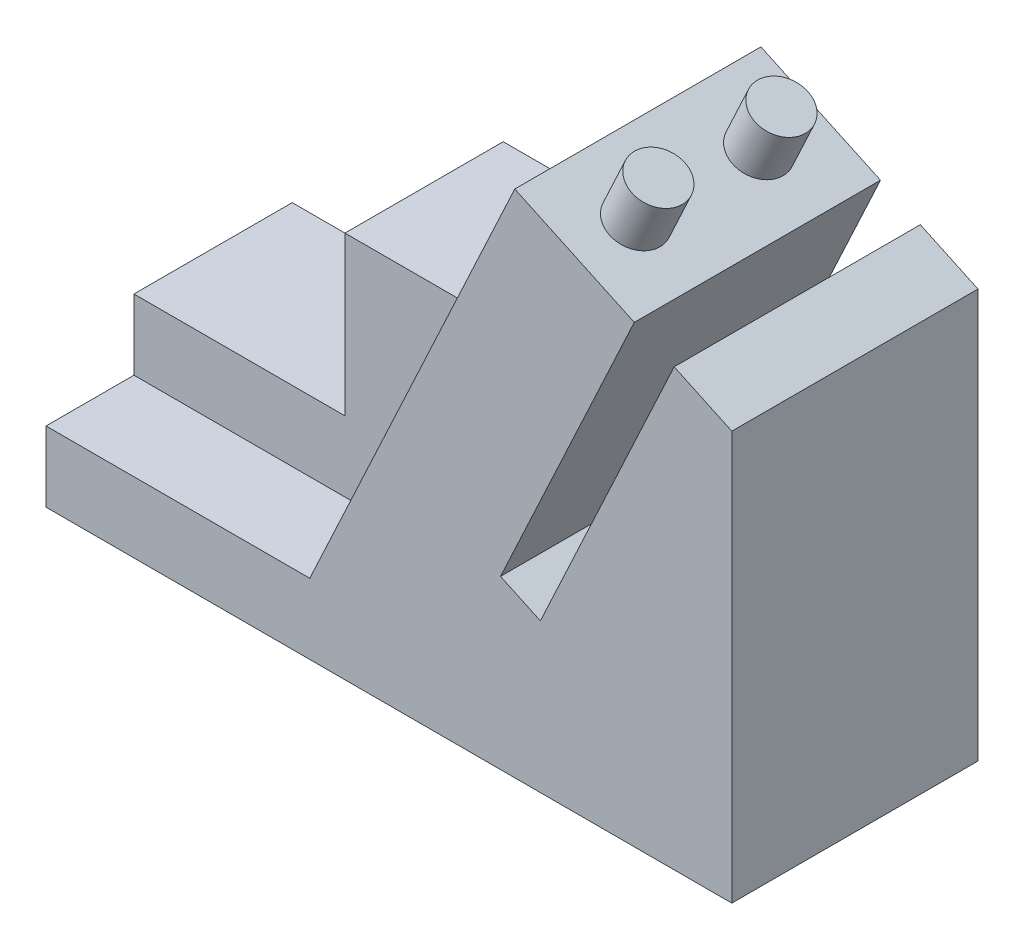
ISO-10303-21;
HEADER;
FILE_DESCRIPTION(('STEP AP214'),'2;1');
FILE_NAME('part.step','',(''),(''),'','','');
FILE_SCHEMA(('AUTOMOTIVE_DESIGN { 1 0 10303 214 1 1 1 1 }'));
ENDSEC;
DATA;
#1=APPLICATION_CONTEXT('core data for automotive mechanical design processes');
#2=APPLICATION_PROTOCOL_DEFINITION('international standard','automotive_design',2000,#1);
#3=PRODUCT_CONTEXT('',#1,'mechanical');
#4=PRODUCT('Part','Part','',(#3));
#5=PRODUCT_RELATED_PRODUCT_CATEGORY('part','',(#4));
#6=PRODUCT_DEFINITION_FORMATION('','',#4);
#7=PRODUCT_DEFINITION_CONTEXT('part definition',#1,'design');
#8=PRODUCT_DEFINITION('design','',#6,#7);
#9=PRODUCT_DEFINITION_SHAPE('','',#8);
#10=(LENGTH_UNIT() NAMED_UNIT(*) SI_UNIT(.MILLI.,.METRE.));
#11=(NAMED_UNIT(*) PLANE_ANGLE_UNIT() SI_UNIT($,.RADIAN.));
#12=(NAMED_UNIT(*) SI_UNIT($,.STERADIAN.) SOLID_ANGLE_UNIT());
#13=UNCERTAINTY_MEASURE_WITH_UNIT(LENGTH_MEASURE(1.E-05),#10,'distance_accuracy_value','');
#14=(GEOMETRIC_REPRESENTATION_CONTEXT(3) GLOBAL_UNCERTAINTY_ASSIGNED_CONTEXT((#13)) GLOBAL_UNIT_ASSIGNED_CONTEXT((#10,
#11,#12)) REPRESENTATION_CONTEXT('',''));
#15=CARTESIAN_POINT('',(0.,0.,0.));
#16=DIRECTION('',(0.,0.,1.));
#17=DIRECTION('',(1.,0.,0.));
#18=AXIS2_PLACEMENT_3D('',#15,#16,#17);
#19=CARTESIAN_POINT('',(53.3153829077502,58.,28.));
#20=DIRECTION('',(0.906307787036648,-0.422618261740704,0.));
#21=DIRECTION('',(0.422618261740704,0.906307787036648,0.));
#22=AXIS2_PLACEMENT_3D('',#19,#20,#21);
#23=PLANE('',#22);
#24=DIRECTION('',(0.,0.,-1.));
#25=VECTOR('',#24,1.);
#26=CARTESIAN_POINT('',(42.1239991120301,34.,18.));
#27=LINE('',#26,#25);
#28=CARTESIAN_POINT('',(42.1239991120301,34.,18.));
#29=VERTEX_POINT('',#28);
#30=CARTESIAN_POINT('',(42.1239991120301,34.,0.));
#31=VERTEX_POINT('',#30);
#32=EDGE_CURVE('E56',#29,#31,#27,.T.);
#33=ORIENTED_EDGE('',*,*,#32,.F.);
#34=DIRECTION('',(0.422618261740703,0.906307787036648,0.));
#35=VECTOR('',#34,1.);
#36=CARTESIAN_POINT('',(30.,8.00000000000001,18.));
#37=LINE('',#36,#35);
#38=CARTESIAN_POINT('',(30.,8.00000000000001,18.));
#39=VERTEX_POINT('',#38);
#40=EDGE_CURVE('E60',#39,#29,#37,.T.);
#41=ORIENTED_EDGE('',*,*,#40,.F.);
#42=DIRECTION('',(0.,0.,-1.));
#43=VECTOR('',#42,1.);
#44=CARTESIAN_POINT('',(30.,8.00000000000001,28.));
#45=LINE('',#44,#43);
#46=CARTESIAN_POINT('',(30.,8.00000000000001,28.));
#47=VERTEX_POINT('',#46);
#48=EDGE_CURVE('E230',#47,#39,#45,.T.);
#49=ORIENTED_EDGE('',*,*,#48,.F.);
#50=DIRECTION('',(-0.422618261740704,-0.906307787036648,0.));
#51=VECTOR('',#50,1.);
#52=CARTESIAN_POINT('',(53.3153829077502,58.,28.));
#53=LINE('',#52,#51);
#54=CARTESIAN_POINT('',(53.3153829077502,58.,28.));
#55=VERTEX_POINT('',#54);
#56=EDGE_CURVE('E206',#55,#47,#53,.T.);
#57=ORIENTED_EDGE('',*,*,#56,.F.);
#58=DIRECTION('',(0.,0.,-1.));
#59=VECTOR('',#58,1.);
#60=CARTESIAN_POINT('',(53.3153829077502,58.,28.));
#61=LINE('',#60,#59);
#62=CARTESIAN_POINT('',(53.3153829077502,58.,0.));
#63=VERTEX_POINT('',#62);
#64=EDGE_CURVE('E232',#55,#63,#61,.T.);
#65=ORIENTED_EDGE('',*,*,#64,.T.);
#66=DIRECTION('',(-0.422618261740704,-0.906307787036648,0.));
#67=VECTOR('',#66,1.);
#68=CARTESIAN_POINT('',(53.3153829077502,58.,0.));
#69=LINE('',#68,#67);
#70=EDGE_CURVE('E192',#63,#31,#69,.T.);
#71=ORIENTED_EDGE('',*,*,#70,.T.);
#72=EDGE_LOOP('',(#33,#41,#49,#57,#65,#71));
#73=FACE_BOUND('',#72,.T.);
#74=ADVANCED_FACE('F41',(#73),#23,.F.);
#75=CARTESIAN_POINT('',(0.,8.,28.));
#76=DIRECTION('',(1.,0.,0.));
#77=DIRECTION('',(0.,0.,-1.));
#78=AXIS2_PLACEMENT_3D('',#75,#76,#77);
#79=PLANE('',#78);
#80=DIRECTION('',(0.,-1.,0.));
#81=VECTOR('',#80,1.);
#82=CARTESIAN_POINT('',(0.,8.,0.));
#83=LINE('',#82,#81);
#84=CARTESIAN_POINT('',(0.,16.,0.));
#85=VERTEX_POINT('',#84);
#86=CARTESIAN_POINT('',(0.,0.,0.));
#87=VERTEX_POINT('',#86);
#88=EDGE_CURVE('E187',#85,#87,#83,.T.);
#89=ORIENTED_EDGE('',*,*,#88,.T.);
#90=DIRECTION('',(0.,0.,-1.));
#91=VECTOR('',#90,1.);
#92=CARTESIAN_POINT('',(0.,0.,28.));
#93=LINE('',#92,#91);
#94=CARTESIAN_POINT('',(0.,0.,28.));
#95=VERTEX_POINT('',#94);
#96=EDGE_CURVE('E253',#95,#87,#93,.T.);
#97=ORIENTED_EDGE('',*,*,#96,.F.);
#98=DIRECTION('',(0.,-1.,0.));
#99=VECTOR('',#98,1.);
#100=CARTESIAN_POINT('',(0.,8.,28.));
#101=LINE('',#100,#99);
#102=CARTESIAN_POINT('',(0.,8.,28.));
#103=VERTEX_POINT('',#102);
#104=EDGE_CURVE('E188',#103,#95,#101,.T.);
#105=ORIENTED_EDGE('',*,*,#104,.F.);
#106=DIRECTION('',(0.,0.,-1.));
#107=VECTOR('',#106,1.);
#108=CARTESIAN_POINT('',(0.,8.,28.));
#109=LINE('',#108,#107);
#110=CARTESIAN_POINT('',(0.,8.,18.));
#111=VERTEX_POINT('',#110);
#112=EDGE_CURVE('E210',#103,#111,#109,.T.);
#113=ORIENTED_EDGE('',*,*,#112,.T.);
#114=DIRECTION('',(0.,-1.,0.));
#115=VECTOR('',#114,1.);
#116=CARTESIAN_POINT('',(0.,8.,18.));
#117=LINE('',#116,#115);
#118=CARTESIAN_POINT('',(0.,16.,18.));
#119=VERTEX_POINT('',#118);
#120=EDGE_CURVE('E163',#119,#111,#117,.T.);
#121=ORIENTED_EDGE('',*,*,#120,.F.);
#122=DIRECTION('',(0.,0.,-1.));
#123=VECTOR('',#122,1.);
#124=CARTESIAN_POINT('',(0.,16.,18.));
#125=LINE('',#124,#123);
#126=EDGE_CURVE('E169',#119,#85,#125,.T.);
#127=ORIENTED_EDGE('',*,*,#126,.T.);
#128=EDGE_LOOP('',(#89,#97,#105,#113,#121,#127));
#129=FACE_BOUND('',#128,.T.);
#130=ADVANCED_FACE('F43',(#129),#79,.F.);
#131=CARTESIAN_POINT('',(0.,0.,28.));
#132=DIRECTION('',(0.,1.,0.));
#133=DIRECTION('',(0.,0.,1.));
#134=AXIS2_PLACEMENT_3D('',#131,#132,#133);
#135=PLANE('',#134);
#136=DIRECTION('',(1.,0.,0.));
#137=VECTOR('',#136,1.);
#138=CARTESIAN_POINT('',(0.,0.,0.));
#139=LINE('',#138,#137);
#140=CARTESIAN_POINT('',(78.,0.,0.));
#141=VERTEX_POINT('',#140);
#142=EDGE_CURVE('E213',#87,#141,#139,.T.);
#143=ORIENTED_EDGE('',*,*,#142,.T.);
#144=DIRECTION('',(0.,0.,-1.));
#145=VECTOR('',#144,1.);
#146=CARTESIAN_POINT('',(78.,0.,28.));
#147=LINE('',#146,#145);
#148=CARTESIAN_POINT('',(78.,0.,28.));
#149=VERTEX_POINT('',#148);
#150=EDGE_CURVE('E250',#149,#141,#147,.T.);
#151=ORIENTED_EDGE('',*,*,#150,.F.);
#152=DIRECTION('',(1.,0.,0.));
#153=VECTOR('',#152,1.);
#154=CARTESIAN_POINT('',(0.,0.,28.));
#155=LINE('',#154,#153);
#156=EDGE_CURVE('E191',#95,#149,#155,.T.);
#157=ORIENTED_EDGE('',*,*,#156,.F.);
#158=ORIENTED_EDGE('',*,*,#96,.T.);
#159=EDGE_LOOP('',(#143,#151,#157,#158));
#160=FACE_BOUND('',#159,.T.);
#161=ADVANCED_FACE('F314',(#160),#135,.F.);
#162=CARTESIAN_POINT('',(78.,0.,28.));
#163=DIRECTION('',(-1.,0.,0.));
#164=DIRECTION('',(0.,0.,1.));
#165=AXIS2_PLACEMENT_3D('',#162,#163,#164);
#166=PLANE('',#165);
#167=DIRECTION('',(0.,1.,0.));
#168=VECTOR('',#167,1.);
#169=CARTESIAN_POINT('',(78.,0.,0.));
#170=LINE('',#169,#168);
#171=CARTESIAN_POINT('',(78.,46.48937401126,0.));
#172=VERTEX_POINT('',#171);
#173=EDGE_CURVE('E215',#141,#172,#170,.T.);
#174=ORIENTED_EDGE('',*,*,#173,.T.);
#175=DIRECTION('',(0.,0.,-1.));
#176=VECTOR('',#175,1.);
#177=CARTESIAN_POINT('',(78.,46.48937401126,28.));
#178=LINE('',#177,#176);
#179=CARTESIAN_POINT('',(78.,46.48937401126,28.));
#180=VERTEX_POINT('',#179);
#181=EDGE_CURVE('E247',#180,#172,#178,.T.);
#182=ORIENTED_EDGE('',*,*,#181,.F.);
#183=DIRECTION('',(0.,1.,0.));
#184=VECTOR('',#183,1.);
#185=CARTESIAN_POINT('',(78.,0.,28.));
#186=LINE('',#185,#184);
#187=EDGE_CURVE('E194',#149,#180,#186,.T.);
#188=ORIENTED_EDGE('',*,*,#187,.F.);
#189=ORIENTED_EDGE('',*,*,#150,.T.);
#190=EDGE_LOOP('',(#174,#182,#188,#189));
#191=FACE_BOUND('',#190,.T.);
#192=ADVANCED_FACE('F310',(#191),#166,.F.);
#193=CARTESIAN_POINT('',(78.,46.48937401126,28.));
#194=DIRECTION('',(-0.422618261740703,-0.906307787036648,0.));
#195=DIRECTION('',(0.906307787036648,-0.422618261740703,0.));
#196=AXIS2_PLACEMENT_3D('',#193,#194,#195);
#197=PLANE('',#196);
#198=DIRECTION('',(-0.906307787036648,0.422618261740703,0.));
#199=VECTOR('',#198,1.);
#200=CARTESIAN_POINT('',(78.,46.48937401126,0.));
#201=LINE('',#200,#199);
#202=CARTESIAN_POINT('',(71.4415386484832,49.5476347651859,0.));
#203=VERTEX_POINT('',#202);
#204=EDGE_CURVE('E217',#172,#203,#201,.T.);
#205=ORIENTED_EDGE('',*,*,#204,.T.);
#206=DIRECTION('',(0.,0.,-1.));
#207=VECTOR('',#206,1.);
#208=CARTESIAN_POINT('',(71.4415386484832,49.5476347651859,28.));
#209=LINE('',#208,#207);
#210=CARTESIAN_POINT('',(71.4415386484832,49.5476347651859,28.));
#211=VERTEX_POINT('',#210);
#212=EDGE_CURVE('E244',#211,#203,#209,.T.);
#213=ORIENTED_EDGE('',*,*,#212,.F.);
#214=DIRECTION('',(-0.906307787036648,0.422618261740703,0.));
#215=VECTOR('',#214,1.);
#216=CARTESIAN_POINT('',(78.,46.48937401126,28.));
#217=LINE('',#216,#215);
#218=EDGE_CURVE('E196',#180,#211,#217,.T.);
#219=ORIENTED_EDGE('',*,*,#218,.F.);
#220=ORIENTED_EDGE('',*,*,#181,.T.);
#221=EDGE_LOOP('',(#205,#213,#219,#220));
#222=FACE_BOUND('',#221,.T.);
#223=ADVANCED_FACE('F306',(#222),#197,.F.);
#224=CARTESIAN_POINT('',(56.2272812258179,16.9205544318666,28.));
#225=DIRECTION('',(0.906307787036648,-0.422618261740703,0.));
#226=DIRECTION('',(0.422618261740703,0.906307787036648,0.));
#227=AXIS2_PLACEMENT_3D('',#224,#225,#226);
#228=PLANE('',#227);
#229=DIRECTION('',(-0.422618261740703,-0.906307787036648,0.));
#230=VECTOR('',#229,1.);
#231=CARTESIAN_POINT('',(56.2272812258179,16.9205544318666,0.));
#232=LINE('',#231,#230);
#233=CARTESIAN_POINT('',(56.2272812258179,16.9205544318666,0.));
#234=VERTEX_POINT('',#233);
#235=EDGE_CURVE('E219',#203,#234,#232,.T.);
#236=ORIENTED_EDGE('',*,*,#235,.T.);
#237=DIRECTION('',(0.,0.,-1.));
#238=VECTOR('',#237,1.);
#239=CARTESIAN_POINT('',(56.2272812258179,16.9205544318666,28.));
#240=LINE('',#239,#238);
#241=CARTESIAN_POINT('',(56.2272812258179,16.9205544318666,28.));
#242=VERTEX_POINT('',#241);
#243=EDGE_CURVE('E241',#242,#234,#240,.T.);
#244=ORIENTED_EDGE('',*,*,#243,.F.);
#245=DIRECTION('',(-0.422618261740703,-0.906307787036648,0.));
#246=VECTOR('',#245,1.);
#247=CARTESIAN_POINT('',(56.2272812258179,16.9205544318666,28.));
#248=LINE('',#247,#246);
#249=EDGE_CURVE('E198',#211,#242,#248,.T.);
#250=ORIENTED_EDGE('',*,*,#249,.F.);
#251=ORIENTED_EDGE('',*,*,#212,.T.);
#252=EDGE_LOOP('',(#236,#244,#250,#251));
#253=FACE_BOUND('',#252,.T.);
#254=ADVANCED_FACE('F302',(#253),#228,.F.);
#255=CARTESIAN_POINT('',(51.6957422906346,19.0336457405701,28.));
#256=DIRECTION('',(-0.422618261740704,-0.906307787036648,0.));
#257=DIRECTION('',(0.906307787036648,-0.422618261740704,0.));
#258=AXIS2_PLACEMENT_3D('',#255,#256,#257);
#259=PLANE('',#258);
#260=DIRECTION('',(-0.906307787036648,0.422618261740704,0.));
#261=VECTOR('',#260,1.);
#262=CARTESIAN_POINT('',(51.6957422906346,19.0336457405701,0.));
#263=LINE('',#262,#261);
#264=CARTESIAN_POINT('',(51.6957422906346,19.0336457405701,0.));
#265=VERTEX_POINT('',#264);
#266=EDGE_CURVE('E221',#234,#265,#263,.T.);
#267=ORIENTED_EDGE('',*,*,#266,.T.);
#268=DIRECTION('',(0.,0.,-1.));
#269=VECTOR('',#268,1.);
#270=CARTESIAN_POINT('',(51.6957422906346,19.0336457405701,28.));
#271=LINE('',#270,#269);
#272=CARTESIAN_POINT('',(51.6957422906346,19.0336457405701,28.));
#273=VERTEX_POINT('',#272);
#274=EDGE_CURVE('E238',#273,#265,#271,.T.);
#275=ORIENTED_EDGE('',*,*,#274,.F.);
#276=DIRECTION('',(-0.906307787036648,0.422618261740704,0.));
#277=VECTOR('',#276,1.);
#278=CARTESIAN_POINT('',(51.6957422906346,19.0336457405701,28.));
#279=LINE('',#278,#277);
#280=EDGE_CURVE('E200',#242,#273,#279,.T.);
#281=ORIENTED_EDGE('',*,*,#280,.F.);
#282=ORIENTED_EDGE('',*,*,#243,.T.);
#283=EDGE_LOOP('',(#267,#275,#281,#282));
#284=FACE_BOUND('',#283,.T.);
#285=ADVANCED_FACE('F298',(#284),#259,.F.);
#286=CARTESIAN_POINT('',(66.9099997132999,51.6607260738894,28.));
#287=DIRECTION('',(-0.906307787036648,0.422618261740703,0.));
#288=DIRECTION('',(-0.422618261740703,-0.906307787036648,0.));
#289=AXIS2_PLACEMENT_3D('',#286,#287,#288);
#290=PLANE('',#289);
#291=DIRECTION('',(0.422618261740703,0.906307787036648,0.));
#292=VECTOR('',#291,1.);
#293=CARTESIAN_POINT('',(66.9099997132999,51.6607260738894,0.));
#294=LINE('',#293,#292);
#295=CARTESIAN_POINT('',(66.9099997132999,51.6607260738894,0.));
#296=VERTEX_POINT('',#295);
#297=EDGE_CURVE('E223',#265,#296,#294,.T.);
#298=ORIENTED_EDGE('',*,*,#297,.T.);
#299=DIRECTION('',(0.,0.,-1.));
#300=VECTOR('',#299,1.);
#301=CARTESIAN_POINT('',(66.9099997132999,51.6607260738894,28.));
#302=LINE('',#301,#300);
#303=CARTESIAN_POINT('',(66.9099997132999,51.6607260738894,28.));
#304=VERTEX_POINT('',#303);
#305=EDGE_CURVE('E235',#304,#296,#302,.T.);
#306=ORIENTED_EDGE('',*,*,#305,.F.);
#307=DIRECTION('',(0.422618261740703,0.906307787036648,0.));
#308=VECTOR('',#307,1.);
#309=CARTESIAN_POINT('',(66.9099997132999,51.6607260738894,28.));
#310=LINE('',#309,#308);
#311=EDGE_CURVE('E202',#273,#304,#310,.T.);
#312=ORIENTED_EDGE('',*,*,#311,.F.);
#313=ORIENTED_EDGE('',*,*,#274,.T.);
#314=EDGE_LOOP('',(#298,#306,#312,#313));
#315=FACE_BOUND('',#314,.T.);
#316=ADVANCED_FACE('F264',(#315),#290,.F.);
#317=CARTESIAN_POINT('',(66.9099997132999,51.6607260738894,28.));
#318=DIRECTION('',(-0.422618261740704,-0.906307787036648,0.));
#319=DIRECTION('',(0.906307787036648,-0.422618261740704,0.));
#320=AXIS2_PLACEMENT_3D('',#317,#318,#319);
#321=PLANE('',#320);
#322=CARTESIAN_POINT('',(60.1126913105251,54.8303630369447,21.));
#323=DIRECTION('',(-0.422618261740704,-0.906307787036648,0.));
#324=DIRECTION('',(0.906307787036648,-0.422618261740704,0.));
#325=AXIS2_PLACEMENT_3D('',#322,#323,#324);
#326=CIRCLE('',#325,3.00000000000001);
#327=CARTESIAN_POINT('',(62.831614671635,53.5625082517226,21.));
#328=VERTEX_POINT('',#327);
#329=EDGE_CURVE('E11',#328,#328,#326,.F.);
#330=ORIENTED_EDGE('',*,*,#329,.F.);
#331=EDGE_LOOP('',(#330));
#332=FACE_BOUND('',#331,.T.);
#333=CARTESIAN_POINT('',(60.1126913105251,54.8303630369447,7.));
#334=DIRECTION('',(-0.422618261740704,-0.906307787036648,0.));
#335=DIRECTION('',(0.906307787036648,-0.422618261740704,0.));
#336=AXIS2_PLACEMENT_3D('',#333,#334,#335);
#337=CIRCLE('',#336,3.00000000000001);
#338=CARTESIAN_POINT('',(62.831614671635,53.5625082517226,7.));
#339=VERTEX_POINT('',#338);
#340=EDGE_CURVE('E49',#339,#339,#337,.F.);
#341=ORIENTED_EDGE('',*,*,#340,.F.);
#342=EDGE_LOOP('',(#341));
#343=FACE_BOUND('',#342,.T.);
#344=DIRECTION('',(-0.906307787036648,0.422618261740704,0.));
#345=VECTOR('',#344,1.);
#346=CARTESIAN_POINT('',(66.9099997132999,51.6607260738894,0.));
#347=LINE('',#346,#345);
#348=EDGE_CURVE('E225',#296,#63,#347,.T.);
#349=ORIENTED_EDGE('',*,*,#348,.T.);
#350=ORIENTED_EDGE('',*,*,#64,.F.);
#351=DIRECTION('',(-0.906307787036648,0.422618261740704,0.));
#352=VECTOR('',#351,1.);
#353=CARTESIAN_POINT('',(66.9099997132999,51.6607260738894,28.));
#354=LINE('',#353,#352);
#355=EDGE_CURVE('E204',#304,#55,#354,.T.);
#356=ORIENTED_EDGE('',*,*,#355,.F.);
#357=ORIENTED_EDGE('',*,*,#305,.T.);
#358=EDGE_LOOP('',(#349,#350,#356,#357));
#359=FACE_BOUND('',#358,.T.);
#360=ADVANCED_FACE('F260',(#332,#343,#359),#321,.F.);
#361=CARTESIAN_POINT('',(30.,8.00000000000001,28.));
#362=DIRECTION('',(0.,-1.,0.));
#363=DIRECTION('',(1.,0.,0.));
#364=AXIS2_PLACEMENT_3D('',#361,#362,#363);
#365=PLANE('',#364);
#366=ORIENTED_EDGE('',*,*,#48,.T.);
#367=DIRECTION('',(1.,0.,0.));
#368=VECTOR('',#367,1.);
#369=CARTESIAN_POINT('',(0.,8.,18.));
#370=LINE('',#369,#368);
#371=EDGE_CURVE('E176',#111,#39,#370,.T.);
#372=ORIENTED_EDGE('',*,*,#371,.F.);
#373=ORIENTED_EDGE('',*,*,#112,.F.);
#374=DIRECTION('',(-1.,0.,0.));
#375=VECTOR('',#374,1.);
#376=CARTESIAN_POINT('',(30.,8.00000000000001,28.));
#377=LINE('',#376,#375);
#378=EDGE_CURVE('E208',#47,#103,#377,.T.);
#379=ORIENTED_EDGE('',*,*,#378,.F.);
#380=EDGE_LOOP('',(#366,#372,#373,#379));
#381=FACE_BOUND('',#380,.T.);
#382=ADVANCED_FACE('F263',(#381),#365,.F.);
#383=CARTESIAN_POINT('',(0.,0.,28.));
#384=DIRECTION('',(0.,0.,1.));
#385=DIRECTION('',(1.,0.,0.));
#386=AXIS2_PLACEMENT_3D('',#383,#384,#385);
#387=PLANE('',#386);
#388=ORIENTED_EDGE('',*,*,#104,.T.);
#389=ORIENTED_EDGE('',*,*,#156,.T.);
#390=ORIENTED_EDGE('',*,*,#187,.T.);
#391=ORIENTED_EDGE('',*,*,#218,.T.);
#392=ORIENTED_EDGE('',*,*,#249,.T.);
#393=ORIENTED_EDGE('',*,*,#280,.T.);
#394=ORIENTED_EDGE('',*,*,#311,.T.);
#395=ORIENTED_EDGE('',*,*,#355,.T.);
#396=ORIENTED_EDGE('',*,*,#56,.T.);
#397=ORIENTED_EDGE('',*,*,#378,.T.);
#398=EDGE_LOOP('',(#388,#389,#390,#391,#392,#393,#394,#395,#396,#397));
#399=FACE_BOUND('',#398,.T.);
#400=ADVANCED_FACE('F289',(#399),#387,.T.);
#401=CARTESIAN_POINT('',(0.,0.,0.));
#402=DIRECTION('',(0.,0.,1.));
#403=DIRECTION('',(1.,0.,0.));
#404=AXIS2_PLACEMENT_3D('',#401,#402,#403);
#405=PLANE('',#404);
#406=ORIENTED_EDGE('',*,*,#88,.F.);
#407=DIRECTION('',(-1.,0.,0.));
#408=VECTOR('',#407,1.);
#409=CARTESIAN_POINT('',(0.,16.,0.));
#410=LINE('',#409,#408);
#411=CARTESIAN_POINT('',(24.,16.,0.));
#412=VERTEX_POINT('',#411);
#413=EDGE_CURVE('E173',#412,#85,#410,.T.);
#414=ORIENTED_EDGE('',*,*,#413,.F.);
#415=DIRECTION('',(0.,-1.,0.));
#416=VECTOR('',#415,1.);
#417=CARTESIAN_POINT('',(24.,16.,0.));
#418=LINE('',#417,#416);
#419=CARTESIAN_POINT('',(24.,34.,0.));
#420=VERTEX_POINT('',#419);
#421=EDGE_CURVE('E171',#420,#412,#418,.T.);
#422=ORIENTED_EDGE('',*,*,#421,.F.);
#423=DIRECTION('',(-1.,0.,0.));
#424=VECTOR('',#423,1.);
#425=CARTESIAN_POINT('',(24.,34.,0.));
#426=LINE('',#425,#424);
#427=EDGE_CURVE('E153',#31,#420,#426,.T.);
#428=ORIENTED_EDGE('',*,*,#427,.F.);
#429=ORIENTED_EDGE('',*,*,#70,.F.);
#430=ORIENTED_EDGE('',*,*,#348,.F.);
#431=ORIENTED_EDGE('',*,*,#297,.F.);
#432=ORIENTED_EDGE('',*,*,#266,.F.);
#433=ORIENTED_EDGE('',*,*,#235,.F.);
#434=ORIENTED_EDGE('',*,*,#204,.F.);
#435=ORIENTED_EDGE('',*,*,#173,.F.);
#436=ORIENTED_EDGE('',*,*,#142,.F.);
#437=EDGE_LOOP('',(#406,#414,#422,#428,#429,#430,#431,#432,#433,#434,#435,#436));
#438=FACE_BOUND('',#437,.T.);
#439=ADVANCED_FACE('F275',(#438),#405,.F.);
#440=CARTESIAN_POINT('',(62.6484008809693,60.2682097591646,7.));
#441=DIRECTION('',(-0.422618261740704,-0.906307787036648,0.));
#442=DIRECTION('',(0.906307787036648,-0.422618261740704,0.));
#443=AXIS2_PLACEMENT_3D('',#440,#441,#442);
#444=CYLINDRICAL_SURFACE('',#443,3.00000000000001);
#445=CARTESIAN_POINT('',(62.6484008809693,60.2682097591646,7.));
#446=DIRECTION('',(0.422618261740704,0.906307787036648,0.));
#447=DIRECTION('',(-0.906307787036648,0.422618261740704,0.));
#448=AXIS2_PLACEMENT_3D('',#445,#446,#447);
#449=CIRCLE('',#448,3.00000000000001);
#450=CARTESIAN_POINT('',(59.9294775198593,61.5360645443867,7.));
#451=VERTEX_POINT('',#450);
#452=EDGE_CURVE('E184',#451,#451,#449,.T.);
#453=ORIENTED_EDGE('',*,*,#452,.F.);
#454=EDGE_LOOP('',(#453));
#455=FACE_BOUND('',#454,.T.);
#456=ORIENTED_EDGE('',*,*,#340,.T.);
#457=EDGE_LOOP('',(#456));
#458=FACE_BOUND('',#457,.T.);
#459=ADVANCED_FACE('F258',(#455,#458),#444,.T.);
#460=CARTESIAN_POINT('',(62.6484008809693,60.2682097591646,7.));
#461=DIRECTION('',(0.422618261740704,0.906307787036648,0.));
#462=DIRECTION('',(-0.906307787036648,0.422618261740704,0.));
#463=AXIS2_PLACEMENT_3D('',#460,#461,#462);
#464=PLANE('',#463);
#465=ORIENTED_EDGE('',*,*,#452,.T.);
#466=EDGE_LOOP('',(#465));
#467=FACE_BOUND('',#466,.T.);
#468=ADVANCED_FACE('F379',(#467),#464,.T.);
#469=CARTESIAN_POINT('',(62.6484008809693,60.2682097591646,21.));
#470=DIRECTION('',(-0.422618261740704,-0.906307787036648,0.));
#471=DIRECTION('',(0.906307787036648,-0.422618261740704,0.));
#472=AXIS2_PLACEMENT_3D('',#469,#470,#471);
#473=CYLINDRICAL_SURFACE('',#472,3.00000000000001);
#474=CARTESIAN_POINT('',(62.6484008809693,60.2682097591646,21.));
#475=DIRECTION('',(0.422618261740704,0.906307787036648,0.));
#476=DIRECTION('',(-0.906307787036648,0.422618261740704,0.));
#477=AXIS2_PLACEMENT_3D('',#474,#475,#476);
#478=CIRCLE('',#477,3.00000000000001);
#479=CARTESIAN_POINT('',(59.9294775198593,61.5360645443867,21.));
#480=VERTEX_POINT('',#479);
#481=EDGE_CURVE('E181',#480,#480,#478,.T.);
#482=ORIENTED_EDGE('',*,*,#481,.F.);
#483=EDGE_LOOP('',(#482));
#484=FACE_BOUND('',#483,.T.);
#485=ORIENTED_EDGE('',*,*,#329,.T.);
#486=EDGE_LOOP('',(#485));
#487=FACE_BOUND('',#486,.T.);
#488=ADVANCED_FACE('F387',(#484,#487),#473,.T.);
#489=CARTESIAN_POINT('',(62.6484008809693,60.2682097591646,21.));
#490=DIRECTION('',(0.422618261740704,0.906307787036648,0.));
#491=DIRECTION('',(-0.906307787036648,0.422618261740704,0.));
#492=AXIS2_PLACEMENT_3D('',#489,#490,#491);
#493=PLANE('',#492);
#494=ORIENTED_EDGE('',*,*,#481,.T.);
#495=EDGE_LOOP('',(#494));
#496=FACE_BOUND('',#495,.T.);
#497=ADVANCED_FACE('F395',(#496),#493,.T.);
#498=CARTESIAN_POINT('',(24.,34.,18.));
#499=DIRECTION('',(0.,-1.,0.));
#500=DIRECTION('',(0.,0.,-1.));
#501=AXIS2_PLACEMENT_3D('',#498,#499,#500);
#502=PLANE('',#501);
#503=ORIENTED_EDGE('',*,*,#427,.T.);
#504=DIRECTION('',(0.,0.,-1.));
#505=VECTOR('',#504,1.);
#506=CARTESIAN_POINT('',(24.,34.,18.));
#507=LINE('',#506,#505);
#508=CARTESIAN_POINT('',(24.,34.,18.));
#509=VERTEX_POINT('',#508);
#510=EDGE_CURVE('E150',#509,#420,#507,.T.);
#511=ORIENTED_EDGE('',*,*,#510,.F.);
#512=DIRECTION('',(-1.,0.,0.));
#513=VECTOR('',#512,1.);
#514=CARTESIAN_POINT('',(24.,34.,18.));
#515=LINE('',#514,#513);
#516=EDGE_CURVE('E140',#29,#509,#515,.T.);
#517=ORIENTED_EDGE('',*,*,#516,.F.);
#518=ORIENTED_EDGE('',*,*,#32,.T.);
#519=EDGE_LOOP('',(#503,#511,#517,#518));
#520=FACE_BOUND('',#519,.T.);
#521=ADVANCED_FACE('F151',(#520),#502,.F.);
#522=CARTESIAN_POINT('',(24.,16.,18.));
#523=DIRECTION('',(1.,0.,0.));
#524=DIRECTION('',(0.,0.,-1.));
#525=AXIS2_PLACEMENT_3D('',#522,#523,#524);
#526=PLANE('',#525);
#527=ORIENTED_EDGE('',*,*,#421,.T.);
#528=DIRECTION('',(0.,0.,-1.));
#529=VECTOR('',#528,1.);
#530=CARTESIAN_POINT('',(24.,16.,18.));
#531=LINE('',#530,#529);
#532=CARTESIAN_POINT('',(24.,16.,18.));
#533=VERTEX_POINT('',#532);
#534=EDGE_CURVE('E156',#533,#412,#531,.T.);
#535=ORIENTED_EDGE('',*,*,#534,.F.);
#536=DIRECTION('',(0.,-1.,0.));
#537=VECTOR('',#536,1.);
#538=CARTESIAN_POINT('',(24.,16.,18.));
#539=LINE('',#538,#537);
#540=EDGE_CURVE('E145',#509,#533,#539,.T.);
#541=ORIENTED_EDGE('',*,*,#540,.F.);
#542=ORIENTED_EDGE('',*,*,#510,.T.);
#543=EDGE_LOOP('',(#527,#535,#541,#542));
#544=FACE_BOUND('',#543,.T.);
#545=ADVANCED_FACE('F158',(#544),#526,.F.);
#546=CARTESIAN_POINT('',(0.,16.,18.));
#547=DIRECTION('',(0.,-1.,0.));
#548=DIRECTION('',(0.,0.,-1.));
#549=AXIS2_PLACEMENT_3D('',#546,#547,#548);
#550=PLANE('',#549);
#551=ORIENTED_EDGE('',*,*,#413,.T.);
#552=ORIENTED_EDGE('',*,*,#126,.F.);
#553=DIRECTION('',(-1.,0.,0.));
#554=VECTOR('',#553,1.);
#555=CARTESIAN_POINT('',(0.,16.,18.));
#556=LINE('',#555,#554);
#557=EDGE_CURVE('E161',#533,#119,#556,.T.);
#558=ORIENTED_EDGE('',*,*,#557,.F.);
#559=ORIENTED_EDGE('',*,*,#534,.T.);
#560=EDGE_LOOP('',(#551,#552,#558,#559));
#561=FACE_BOUND('',#560,.T.);
#562=ADVANCED_FACE('F278',(#561),#550,.F.);
#563=CARTESIAN_POINT('',(0.,0.,18.));
#564=DIRECTION('',(0.,0.,1.));
#565=DIRECTION('',(1.,0.,0.));
#566=AXIS2_PLACEMENT_3D('',#563,#564,#565);
#567=PLANE('',#566);
#568=ORIENTED_EDGE('',*,*,#371,.T.);
#569=ORIENTED_EDGE('',*,*,#40,.T.);
#570=ORIENTED_EDGE('',*,*,#516,.T.);
#571=ORIENTED_EDGE('',*,*,#540,.T.);
#572=ORIENTED_EDGE('',*,*,#557,.T.);
#573=ORIENTED_EDGE('',*,*,#120,.T.);
#574=EDGE_LOOP('',(#568,#569,#570,#571,#572,#573));
#575=FACE_BOUND('',#574,.T.);
#576=ADVANCED_FACE('F143',(#575),#567,.T.);
#577=CLOSED_SHELL('',(#74,#130,#161,#192,#223,#254,#285,#316,#360,#382,#400,#439,#459,#468,#488,
#497,#521,#545,#562,#576));
#578=MANIFOLD_SOLID_BREP('B2',#577);
#579=ADVANCED_BREP_SHAPE_REPRESENTATION('',(#18,#578),#14);
#580=SHAPE_DEFINITION_REPRESENTATION(#9,#579);
ENDSEC;
END-ISO-10303-21;
